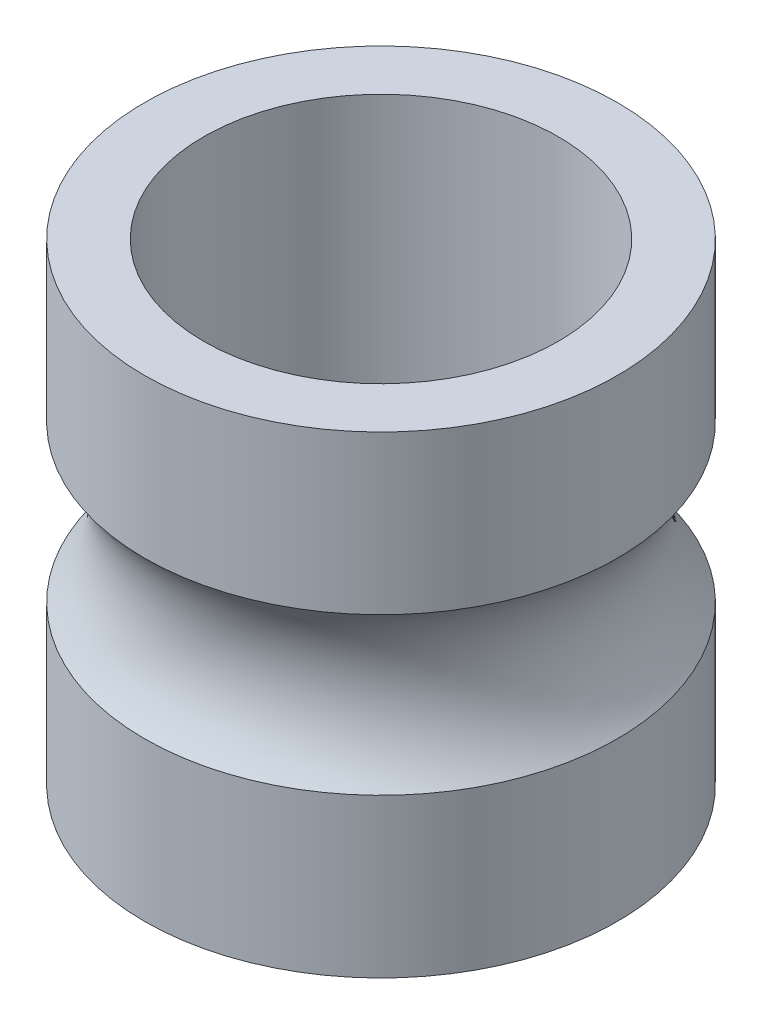
ISO-10303-21;
HEADER;
FILE_DESCRIPTION(('STEP AP214'),'2;1');
FILE_NAME('part.step','',(''),(''),'','','');
FILE_SCHEMA(('AUTOMOTIVE_DESIGN { 1 0 10303 214 1 1 1 1 }'));
ENDSEC;
DATA;
#1=APPLICATION_CONTEXT('core data for automotive mechanical design processes');
#2=APPLICATION_PROTOCOL_DEFINITION('international standard','automotive_design',2000,#1);
#3=PRODUCT_CONTEXT('',#1,'mechanical');
#4=PRODUCT('Part','Part','',(#3));
#5=PRODUCT_RELATED_PRODUCT_CATEGORY('part','',(#4));
#6=PRODUCT_DEFINITION_FORMATION('','',#4);
#7=PRODUCT_DEFINITION_CONTEXT('part definition',#1,'design');
#8=PRODUCT_DEFINITION('design','',#6,#7);
#9=PRODUCT_DEFINITION_SHAPE('','',#8);
#10=(LENGTH_UNIT() NAMED_UNIT(*) SI_UNIT(.MILLI.,.METRE.));
#11=(NAMED_UNIT(*) PLANE_ANGLE_UNIT() SI_UNIT($,.RADIAN.));
#12=(NAMED_UNIT(*) SI_UNIT($,.STERADIAN.) SOLID_ANGLE_UNIT());
#13=UNCERTAINTY_MEASURE_WITH_UNIT(LENGTH_MEASURE(1.E-05),#10,'distance_accuracy_value','');
#14=(GEOMETRIC_REPRESENTATION_CONTEXT(3) GLOBAL_UNCERTAINTY_ASSIGNED_CONTEXT((#13)) GLOBAL_UNIT_ASSIGNED_CONTEXT((#10,
#11,#12)) REPRESENTATION_CONTEXT('',''));
#15=CARTESIAN_POINT('',(0.,0.,0.));
#16=DIRECTION('',(0.,0.,1.));
#17=DIRECTION('',(1.,0.,0.));
#18=AXIS2_PLACEMENT_3D('',#15,#16,#17);
#19=CARTESIAN_POINT('',(0.,2.,0.));
#20=DIRECTION('',(0.,-1.,0.));
#21=DIRECTION('',(0.,0.,-1.));
#22=AXIS2_PLACEMENT_3D('',#19,#20,#21);
#23=CYLINDRICAL_SURFACE('',#22,2.);
#24=CARTESIAN_POINT('',(0.,2.,0.));
#25=DIRECTION('',(0.,1.,0.));
#26=DIRECTION('',(0.,0.,1.));
#27=AXIS2_PLACEMENT_3D('',#24,#25,#26);
#28=CIRCLE('',#27,2.);
#29=CARTESIAN_POINT('',(0.,2.,2.));
#30=VERTEX_POINT('',#29);
#31=EDGE_CURVE('E10',#30,#30,#28,.T.);
#32=ORIENTED_EDGE('',*,*,#31,.F.);
#33=EDGE_LOOP('',(#32));
#34=FACE_BOUND('',#33,.T.);
#35=CARTESIAN_POINT('',(0.,0.661437827766148,0.));
#36=DIRECTION('',(0.,-1.,0.));
#37=DIRECTION('',(0.,0.,-1.));
#38=AXIS2_PLACEMENT_3D('',#35,#36,#37);
#39=CIRCLE('',#38,2.);
#40=CARTESIAN_POINT('',(0.,0.661437827766148,-2.));
#41=VERTEX_POINT('',#40);
#42=EDGE_CURVE('E42',#41,#41,#39,.T.);
#43=ORIENTED_EDGE('',*,*,#42,.F.);
#44=EDGE_LOOP('',(#43));
#45=FACE_BOUND('',#44,.T.);
#46=ADVANCED_FACE('F39',(#34,#45),#23,.T.);
#47=CARTESIAN_POINT('',(0.,-2.,0.));
#48=DIRECTION('',(0.,1.,0.));
#49=DIRECTION('',(0.,0.,1.));
#50=AXIS2_PLACEMENT_3D('',#47,#48,#49);
#51=CIRCLE('',#50,2.);
#52=CARTESIAN_POINT('',(0.,-2.,2.));
#53=VERTEX_POINT('',#52);
#54=EDGE_CURVE('E47',#53,#53,#51,.T.);
#55=ORIENTED_EDGE('',*,*,#54,.T.);
#56=EDGE_LOOP('',(#55));
#57=FACE_BOUND('',#56,.T.);
#58=CARTESIAN_POINT('',(0.,-0.661437827766148,0.));
#59=DIRECTION('',(0.,1.,0.));
#60=DIRECTION('',(0.,0.,1.));
#61=AXIS2_PLACEMENT_3D('',#58,#59,#60);
#62=CIRCLE('',#61,2.);
#63=CARTESIAN_POINT('',(0.,-0.661437827766148,2.));
#64=VERTEX_POINT('',#63);
#65=EDGE_CURVE('E58',#64,#64,#62,.T.);
#66=ORIENTED_EDGE('',*,*,#65,.F.);
#67=EDGE_LOOP('',(#66));
#68=FACE_BOUND('',#67,.T.);
#69=ADVANCED_FACE('F81',(#57,#68),#23,.T.);
#70=CARTESIAN_POINT('',(0.,2.,0.));
#71=DIRECTION('',(0.,1.,0.));
#72=DIRECTION('',(0.,0.,1.));
#73=AXIS2_PLACEMENT_3D('',#70,#71,#72);
#74=PLANE('',#73);
#75=ORIENTED_EDGE('',*,*,#31,.T.);
#76=EDGE_LOOP('',(#75));
#77=FACE_BOUND('',#76,.T.);
#78=CARTESIAN_POINT('',(0.,2.,0.));
#79=DIRECTION('',(0.,1.,0.));
#80=DIRECTION('',(0.,0.,1.));
#81=AXIS2_PLACEMENT_3D('',#78,#79,#80);
#82=CIRCLE('',#81,1.5);
#83=CARTESIAN_POINT('',(0.,2.,1.5));
#84=VERTEX_POINT('',#83);
#85=EDGE_CURVE('E53',#84,#84,#82,.T.);
#86=ORIENTED_EDGE('',*,*,#85,.F.);
#87=EDGE_LOOP('',(#86));
#88=FACE_BOUND('',#87,.T.);
#89=ADVANCED_FACE('F78',(#77,#88),#74,.T.);
#90=CARTESIAN_POINT('',(0.,-2.,0.));
#91=DIRECTION('',(0.,1.,0.));
#92=DIRECTION('',(0.,0.,1.));
#93=AXIS2_PLACEMENT_3D('',#90,#91,#92);
#94=PLANE('',#93);
#95=ORIENTED_EDGE('',*,*,#54,.F.);
#96=EDGE_LOOP('',(#95));
#97=FACE_BOUND('',#96,.T.);
#98=CARTESIAN_POINT('',(0.,-2.,0.));
#99=DIRECTION('',(0.,1.,0.));
#100=DIRECTION('',(0.,0.,1.));
#101=AXIS2_PLACEMENT_3D('',#98,#99,#100);
#102=CIRCLE('',#101,1.5);
#103=CARTESIAN_POINT('',(0.,-2.,1.5));
#104=VERTEX_POINT('',#103);
#105=EDGE_CURVE('E56',#104,#104,#102,.T.);
#106=ORIENTED_EDGE('',*,*,#105,.T.);
#107=EDGE_LOOP('',(#106));
#108=FACE_BOUND('',#107,.T.);
#109=ADVANCED_FACE('F80',(#97,#108),#94,.F.);
#110=CARTESIAN_POINT('',(0.,2.,0.));
#111=DIRECTION('',(0.,-1.,0.));
#112=DIRECTION('',(0.,0.,-1.));
#113=AXIS2_PLACEMENT_3D('',#110,#111,#112);
#114=CYLINDRICAL_SURFACE('',#113,1.5);
#115=ORIENTED_EDGE('',*,*,#85,.T.);
#116=EDGE_LOOP('',(#115));
#117=FACE_BOUND('',#116,.T.);
#118=ORIENTED_EDGE('',*,*,#105,.F.);
#119=EDGE_LOOP('',(#118));
#120=FACE_BOUND('',#119,.T.);
#121=ADVANCED_FACE('F75',(#117,#120),#114,.F.);
#122=CARTESIAN_POINT('',(0.,0.,0.));
#123=DIRECTION('',(0.,1.,0.));
#124=DIRECTION('',(0.,0.,1.));
#125=AXIS2_PLACEMENT_3D('',#122,#123,#124);
#126=TOROIDAL_SURFACE('',#125,2.75,1.);
#127=ORIENTED_EDGE('',*,*,#65,.T.);
#128=EDGE_LOOP('',(#127));
#129=FACE_BOUND('',#128,.T.);
#130=ORIENTED_EDGE('',*,*,#42,.T.);
#131=EDGE_LOOP('',(#130));
#132=FACE_BOUND('',#131,.T.);
#133=ADVANCED_FACE('F106',(#129,#132),#126,.F.);
#134=CLOSED_SHELL('',(#46,#69,#89,#109,#121,#133));
#135=MANIFOLD_SOLID_BREP('B2',#134);
#136=ADVANCED_BREP_SHAPE_REPRESENTATION('',(#18,#135),#14);
#137=SHAPE_DEFINITION_REPRESENTATION(#9,#136);
ENDSEC;
END-ISO-10303-21;
